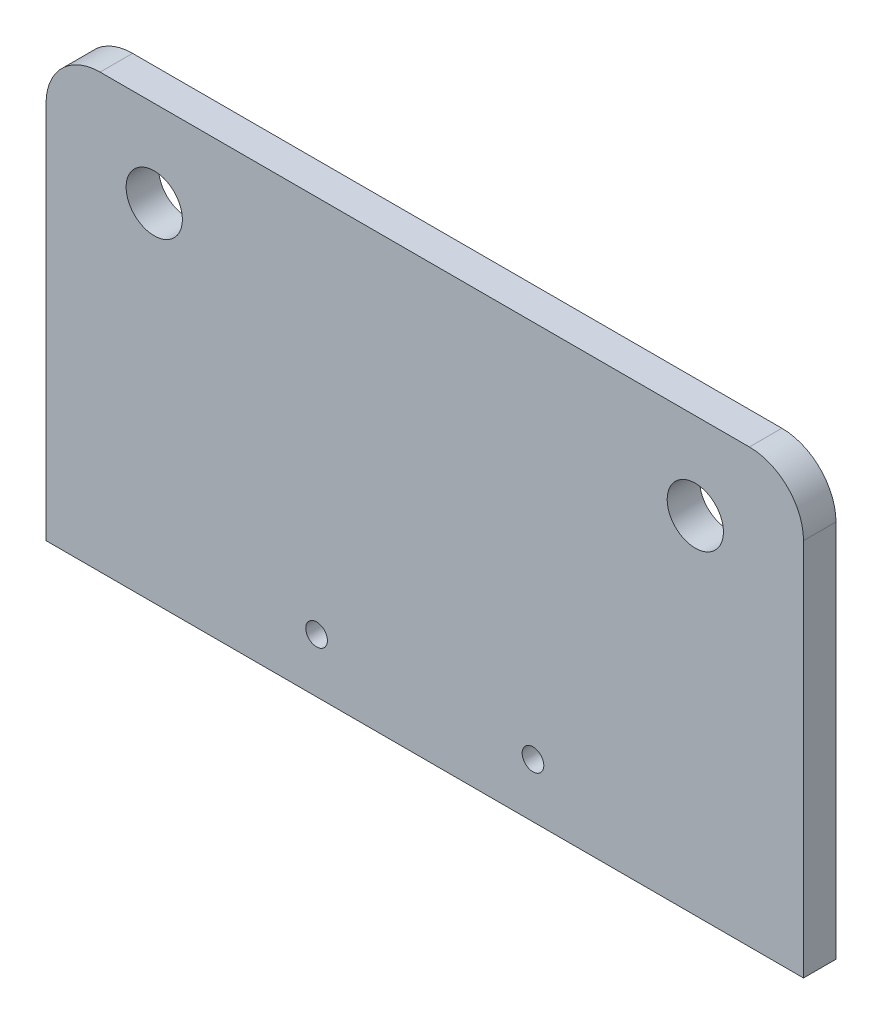
ISO-10303-21;
HEADER;
FILE_DESCRIPTION(('STEP AP214'),'2;1');
FILE_NAME('part.step','',(''),(''),'','','');
FILE_SCHEMA(('AUTOMOTIVE_DESIGN { 1 0 10303 214 1 1 1 1 }'));
ENDSEC;
DATA;
#1=APPLICATION_CONTEXT('core data for automotive mechanical design processes');
#2=APPLICATION_PROTOCOL_DEFINITION('international standard','automotive_design',2000,#1);
#3=PRODUCT_CONTEXT('',#1,'mechanical');
#4=PRODUCT('Part','Part','',(#3));
#5=PRODUCT_RELATED_PRODUCT_CATEGORY('part','',(#4));
#6=PRODUCT_DEFINITION_FORMATION('','',#4);
#7=PRODUCT_DEFINITION_CONTEXT('part definition',#1,'design');
#8=PRODUCT_DEFINITION('design','',#6,#7);
#9=PRODUCT_DEFINITION_SHAPE('','',#8);
#10=(LENGTH_UNIT() NAMED_UNIT(*) SI_UNIT(.MILLI.,.METRE.));
#11=(NAMED_UNIT(*) PLANE_ANGLE_UNIT() SI_UNIT($,.RADIAN.));
#12=(NAMED_UNIT(*) SI_UNIT($,.STERADIAN.) SOLID_ANGLE_UNIT());
#13=UNCERTAINTY_MEASURE_WITH_UNIT(LENGTH_MEASURE(1.E-05),#10,'distance_accuracy_value','');
#14=(GEOMETRIC_REPRESENTATION_CONTEXT(3) GLOBAL_UNCERTAINTY_ASSIGNED_CONTEXT((#13)) GLOBAL_UNIT_ASSIGNED_CONTEXT((#10,
#11,#12)) REPRESENTATION_CONTEXT('',''));
#15=CARTESIAN_POINT('',(0.,0.,0.));
#16=DIRECTION('',(0.,0.,1.));
#17=DIRECTION('',(1.,0.,0.));
#18=AXIS2_PLACEMENT_3D('',#15,#16,#17);
#19=CARTESIAN_POINT('',(-30.,15.,3.));
#20=DIRECTION('',(0.,0.,-1.));
#21=DIRECTION('',(-1.,0.,0.));
#22=AXIS2_PLACEMENT_3D('',#19,#20,#21);
#23=PLANE('',#22);
#24=CARTESIAN_POINT('',(10.,-15.,3.));
#25=DIRECTION('',(0.,0.,-1.));
#26=DIRECTION('',(-1.,0.,0.));
#27=AXIS2_PLACEMENT_3D('',#24,#25,#26);
#28=CIRCLE('',#27,1.);
#29=CARTESIAN_POINT('',(9.,-15.,3.));
#30=VERTEX_POINT('',#29);
#31=EDGE_CURVE('E147',#30,#30,#28,.T.);
#32=ORIENTED_EDGE('',*,*,#31,.T.);
#33=EDGE_LOOP('',(#32));
#34=FACE_BOUND('',#33,.T.);
#35=CARTESIAN_POINT('',(-10.,-15.,3.));
#36=DIRECTION('',(0.,0.,-1.));
#37=DIRECTION('',(1.,0.,0.));
#38=AXIS2_PLACEMENT_3D('',#35,#36,#37);
#39=CIRCLE('',#38,1.);
#40=CARTESIAN_POINT('',(-9.,-15.,3.));
#41=VERTEX_POINT('',#40);
#42=EDGE_CURVE('E153',#41,#41,#39,.T.);
#43=ORIENTED_EDGE('',*,*,#42,.T.);
#44=EDGE_LOOP('',(#43));
#45=FACE_BOUND('',#44,.T.);
#46=DIRECTION('',(0.,-1.,0.));
#47=VECTOR('',#46,1.);
#48=CARTESIAN_POINT('',(-35.,-20.,3.));
#49=LINE('',#48,#47);
#50=CARTESIAN_POINT('',(-35.,15.,3.));
#51=VERTEX_POINT('',#50);
#52=CARTESIAN_POINT('',(-35.,-20.,3.));
#53=VERTEX_POINT('',#52);
#54=EDGE_CURVE('E140',#51,#53,#49,.T.);
#55=ORIENTED_EDGE('',*,*,#54,.T.);
#56=DIRECTION('',(1.,0.,0.));
#57=VECTOR('',#56,1.);
#58=CARTESIAN_POINT('',(-35.,-20.,3.));
#59=LINE('',#58,#57);
#60=CARTESIAN_POINT('',(35.,-20.,3.));
#61=VERTEX_POINT('',#60);
#62=EDGE_CURVE('E98',#53,#61,#59,.T.);
#63=ORIENTED_EDGE('',*,*,#62,.T.);
#64=DIRECTION('',(0.,1.,0.));
#65=VECTOR('',#64,1.);
#66=CARTESIAN_POINT('',(35.,-20.,3.));
#67=LINE('',#66,#65);
#68=CARTESIAN_POINT('',(35.,15.,3.));
#69=VERTEX_POINT('',#68);
#70=EDGE_CURVE('E111',#61,#69,#67,.T.);
#71=ORIENTED_EDGE('',*,*,#70,.T.);
#72=CARTESIAN_POINT('',(30.,15.,3.));
#73=DIRECTION('',(0.,0.,1.));
#74=DIRECTION('',(1.,0.,0.));
#75=AXIS2_PLACEMENT_3D('',#72,#73,#74);
#76=CIRCLE('',#75,5.);
#77=CARTESIAN_POINT('',(30.,20.,3.));
#78=VERTEX_POINT('',#77);
#79=EDGE_CURVE('E105',#69,#78,#76,.T.);
#80=ORIENTED_EDGE('',*,*,#79,.T.);
#81=DIRECTION('',(-1.,0.,0.));
#82=VECTOR('',#81,1.);
#83=CARTESIAN_POINT('',(-30.,20.,3.));
#84=LINE('',#83,#82);
#85=CARTESIAN_POINT('',(-30.,20.,3.));
#86=VERTEX_POINT('',#85);
#87=EDGE_CURVE('E109',#78,#86,#84,.T.);
#88=ORIENTED_EDGE('',*,*,#87,.T.);
#89=CARTESIAN_POINT('',(-30.,15.,3.));
#90=DIRECTION('',(0.,0.,1.));
#91=DIRECTION('',(-1.,0.,0.));
#92=AXIS2_PLACEMENT_3D('',#89,#90,#91);
#93=CIRCLE('',#92,5.);
#94=EDGE_CURVE('E61',#86,#51,#93,.T.);
#95=ORIENTED_EDGE('',*,*,#94,.T.);
#96=EDGE_LOOP('',(#55,#63,#71,#80,#88,#95));
#97=FACE_BOUND('',#96,.T.);
#98=CARTESIAN_POINT('',(-25.,12.,3.));
#99=DIRECTION('',(0.,0.,1.));
#100=DIRECTION('',(1.,0.,0.));
#101=AXIS2_PLACEMENT_3D('',#98,#99,#100);
#102=CIRCLE('',#101,2.6);
#103=CARTESIAN_POINT('',(-22.4,12.,3.));
#104=VERTEX_POINT('',#103);
#105=EDGE_CURVE('E133',#104,#104,#102,.T.);
#106=ORIENTED_EDGE('',*,*,#105,.F.);
#107=EDGE_LOOP('',(#106));
#108=FACE_BOUND('',#107,.T.);
#109=CARTESIAN_POINT('',(25.,12.,3.));
#110=DIRECTION('',(0.,0.,1.));
#111=DIRECTION('',(-1.,0.,0.));
#112=AXIS2_PLACEMENT_3D('',#109,#110,#111);
#113=CIRCLE('',#112,2.59999999999999);
#114=CARTESIAN_POINT('',(22.4,12.,3.));
#115=VERTEX_POINT('',#114);
#116=EDGE_CURVE('E160',#115,#115,#113,.T.);
#117=ORIENTED_EDGE('',*,*,#116,.F.);
#118=EDGE_LOOP('',(#117));
#119=FACE_BOUND('',#118,.T.);
#120=ADVANCED_FACE('F42',(#34,#45,#97,#108,#119),#23,.F.);
#121=CARTESIAN_POINT('',(-30.,15.,0.));
#122=DIRECTION('',(0.,0.,-1.));
#123=DIRECTION('',(-1.,0.,0.));
#124=AXIS2_PLACEMENT_3D('',#121,#122,#123);
#125=PLANE('',#124);
#126=CARTESIAN_POINT('',(10.,-15.,0.));
#127=DIRECTION('',(0.,0.,-1.));
#128=DIRECTION('',(-1.,0.,0.));
#129=AXIS2_PLACEMENT_3D('',#126,#127,#128);
#130=CIRCLE('',#129,1.);
#131=CARTESIAN_POINT('',(9.,-15.,0.));
#132=VERTEX_POINT('',#131);
#133=EDGE_CURVE('E46',#132,#132,#130,.T.);
#134=ORIENTED_EDGE('',*,*,#133,.F.);
#135=EDGE_LOOP('',(#134));
#136=FACE_BOUND('',#135,.T.);
#137=CARTESIAN_POINT('',(-10.,-15.,0.));
#138=DIRECTION('',(0.,0.,-1.));
#139=DIRECTION('',(-1.,0.,0.));
#140=AXIS2_PLACEMENT_3D('',#137,#138,#139);
#141=CIRCLE('',#140,1.);
#142=CARTESIAN_POINT('',(-11.,-15.,0.));
#143=VERTEX_POINT('',#142);
#144=EDGE_CURVE('E145',#143,#143,#141,.T.);
#145=ORIENTED_EDGE('',*,*,#144,.F.);
#146=EDGE_LOOP('',(#145));
#147=FACE_BOUND('',#146,.T.);
#148=CARTESIAN_POINT('',(-25.,12.,0.));
#149=DIRECTION('',(0.,0.,1.));
#150=DIRECTION('',(1.,0.,0.));
#151=AXIS2_PLACEMENT_3D('',#148,#149,#150);
#152=CIRCLE('',#151,2.6);
#153=CARTESIAN_POINT('',(-22.4,12.,0.));
#154=VERTEX_POINT('',#153);
#155=EDGE_CURVE('E163',#154,#154,#152,.T.);
#156=ORIENTED_EDGE('',*,*,#155,.T.);
#157=EDGE_LOOP('',(#156));
#158=FACE_BOUND('',#157,.T.);
#159=DIRECTION('',(0.,-1.,0.));
#160=VECTOR('',#159,1.);
#161=CARTESIAN_POINT('',(-35.,-20.,0.));
#162=LINE('',#161,#160);
#163=CARTESIAN_POINT('',(-35.,15.,0.));
#164=VERTEX_POINT('',#163);
#165=CARTESIAN_POINT('',(-35.,-20.,0.));
#166=VERTEX_POINT('',#165);
#167=EDGE_CURVE('E129',#164,#166,#162,.T.);
#168=ORIENTED_EDGE('',*,*,#167,.F.);
#169=CARTESIAN_POINT('',(-30.,15.,0.));
#170=DIRECTION('',(0.,0.,1.));
#171=DIRECTION('',(-1.,0.,0.));
#172=AXIS2_PLACEMENT_3D('',#169,#170,#171);
#173=CIRCLE('',#172,5.);
#174=CARTESIAN_POINT('',(-30.,20.,0.));
#175=VERTEX_POINT('',#174);
#176=EDGE_CURVE('E90',#175,#164,#173,.T.);
#177=ORIENTED_EDGE('',*,*,#176,.F.);
#178=DIRECTION('',(-1.,0.,0.));
#179=VECTOR('',#178,1.);
#180=CARTESIAN_POINT('',(-30.,20.,0.));
#181=LINE('',#180,#179);
#182=CARTESIAN_POINT('',(30.,20.,0.));
#183=VERTEX_POINT('',#182);
#184=EDGE_CURVE('E84',#183,#175,#181,.T.);
#185=ORIENTED_EDGE('',*,*,#184,.F.);
#186=CARTESIAN_POINT('',(30.,15.,0.));
#187=DIRECTION('',(0.,0.,1.));
#188=DIRECTION('',(1.,0.,0.));
#189=AXIS2_PLACEMENT_3D('',#186,#187,#188);
#190=CIRCLE('',#189,5.);
#191=CARTESIAN_POINT('',(35.,15.,0.));
#192=VERTEX_POINT('',#191);
#193=EDGE_CURVE('E119',#192,#183,#190,.T.);
#194=ORIENTED_EDGE('',*,*,#193,.F.);
#195=DIRECTION('',(0.,1.,0.));
#196=VECTOR('',#195,1.);
#197=CARTESIAN_POINT('',(35.,-20.,0.));
#198=LINE('',#197,#196);
#199=CARTESIAN_POINT('',(35.,-20.,0.));
#200=VERTEX_POINT('',#199);
#201=EDGE_CURVE('E135',#200,#192,#198,.T.);
#202=ORIENTED_EDGE('',*,*,#201,.F.);
#203=DIRECTION('',(1.,0.,0.));
#204=VECTOR('',#203,1.);
#205=CARTESIAN_POINT('',(-35.,-20.,0.));
#206=LINE('',#205,#204);
#207=EDGE_CURVE('E132',#166,#200,#206,.T.);
#208=ORIENTED_EDGE('',*,*,#207,.F.);
#209=EDGE_LOOP('',(#168,#177,#185,#194,#202,#208));
#210=FACE_BOUND('',#209,.T.);
#211=CARTESIAN_POINT('',(25.,12.,0.));
#212=DIRECTION('',(0.,0.,1.));
#213=DIRECTION('',(-1.,0.,0.));
#214=AXIS2_PLACEMENT_3D('',#211,#212,#213);
#215=CIRCLE('',#214,2.59999999999999);
#216=CARTESIAN_POINT('',(22.4,12.,0.));
#217=VERTEX_POINT('',#216);
#218=EDGE_CURVE('E151',#217,#217,#215,.T.);
#219=ORIENTED_EDGE('',*,*,#218,.T.);
#220=EDGE_LOOP('',(#219));
#221=FACE_BOUND('',#220,.T.);
#222=ADVANCED_FACE('F179',(#136,#147,#158,#210,#221),#125,.T.);
#223=CARTESIAN_POINT('',(-35.,-20.,3.));
#224=DIRECTION('',(1.,0.,0.));
#225=DIRECTION('',(0.,0.,-1.));
#226=AXIS2_PLACEMENT_3D('',#223,#224,#225);
#227=PLANE('',#226);
#228=ORIENTED_EDGE('',*,*,#167,.T.);
#229=DIRECTION('',(0.,0.,-1.));
#230=VECTOR('',#229,1.);
#231=CARTESIAN_POINT('',(-35.,-20.,3.));
#232=LINE('',#231,#230);
#233=EDGE_CURVE('E11',#53,#166,#232,.T.);
#234=ORIENTED_EDGE('',*,*,#233,.F.);
#235=ORIENTED_EDGE('',*,*,#54,.F.);
#236=DIRECTION('',(0.,0.,-1.));
#237=VECTOR('',#236,1.);
#238=CARTESIAN_POINT('',(-35.,15.,3.));
#239=LINE('',#238,#237);
#240=EDGE_CURVE('E125',#51,#164,#239,.T.);
#241=ORIENTED_EDGE('',*,*,#240,.T.);
#242=EDGE_LOOP('',(#228,#234,#235,#241));
#243=FACE_BOUND('',#242,.T.);
#244=ADVANCED_FACE('F44',(#243),#227,.F.);
#245=CARTESIAN_POINT('',(-35.,-20.,3.));
#246=DIRECTION('',(0.,1.,0.));
#247=DIRECTION('',(-1.,0.,0.));
#248=AXIS2_PLACEMENT_3D('',#245,#246,#247);
#249=PLANE('',#248);
#250=ORIENTED_EDGE('',*,*,#207,.T.);
#251=DIRECTION('',(0.,0.,-1.));
#252=VECTOR('',#251,1.);
#253=CARTESIAN_POINT('',(35.,-20.,3.));
#254=LINE('',#253,#252);
#255=EDGE_CURVE('E52',#61,#200,#254,.T.);
#256=ORIENTED_EDGE('',*,*,#255,.F.);
#257=ORIENTED_EDGE('',*,*,#62,.F.);
#258=ORIENTED_EDGE('',*,*,#233,.T.);
#259=EDGE_LOOP('',(#250,#256,#257,#258));
#260=FACE_BOUND('',#259,.T.);
#261=ADVANCED_FACE('F173',(#260),#249,.F.);
#262=CARTESIAN_POINT('',(35.,-20.,3.));
#263=DIRECTION('',(-1.,0.,0.));
#264=DIRECTION('',(0.,0.,1.));
#265=AXIS2_PLACEMENT_3D('',#262,#263,#264);
#266=PLANE('',#265);
#267=ORIENTED_EDGE('',*,*,#201,.T.);
#268=DIRECTION('',(0.,0.,-1.));
#269=VECTOR('',#268,1.);
#270=CARTESIAN_POINT('',(35.,15.,3.));
#271=LINE('',#270,#269);
#272=EDGE_CURVE('E120',#69,#192,#271,.T.);
#273=ORIENTED_EDGE('',*,*,#272,.F.);
#274=ORIENTED_EDGE('',*,*,#70,.F.);
#275=ORIENTED_EDGE('',*,*,#255,.T.);
#276=EDGE_LOOP('',(#267,#273,#274,#275));
#277=FACE_BOUND('',#276,.T.);
#278=ADVANCED_FACE('F176',(#277),#266,.F.);
#279=CARTESIAN_POINT('',(30.,15.,3.));
#280=DIRECTION('',(0.,0.,-1.));
#281=DIRECTION('',(-1.,0.,0.));
#282=AXIS2_PLACEMENT_3D('',#279,#280,#281);
#283=CYLINDRICAL_SURFACE('',#282,5.);
#284=ORIENTED_EDGE('',*,*,#193,.T.);
#285=DIRECTION('',(0.,0.,-1.));
#286=VECTOR('',#285,1.);
#287=CARTESIAN_POINT('',(30.,20.,3.));
#288=LINE('',#287,#286);
#289=EDGE_CURVE('E116',#78,#183,#288,.T.);
#290=ORIENTED_EDGE('',*,*,#289,.F.);
#291=ORIENTED_EDGE('',*,*,#79,.F.);
#292=ORIENTED_EDGE('',*,*,#272,.T.);
#293=EDGE_LOOP('',(#284,#290,#291,#292));
#294=FACE_BOUND('',#293,.T.);
#295=ADVANCED_FACE('F117',(#294),#283,.T.);
#296=CARTESIAN_POINT('',(-30.,20.,3.));
#297=DIRECTION('',(0.,-1.,0.));
#298=DIRECTION('',(0.,0.,-1.));
#299=AXIS2_PLACEMENT_3D('',#296,#297,#298);
#300=PLANE('',#299);
#301=ORIENTED_EDGE('',*,*,#184,.T.);
#302=DIRECTION('',(0.,0.,-1.));
#303=VECTOR('',#302,1.);
#304=CARTESIAN_POINT('',(-30.,20.,3.));
#305=LINE('',#304,#303);
#306=EDGE_CURVE('E121',#86,#175,#305,.T.);
#307=ORIENTED_EDGE('',*,*,#306,.F.);
#308=ORIENTED_EDGE('',*,*,#87,.F.);
#309=ORIENTED_EDGE('',*,*,#289,.T.);
#310=EDGE_LOOP('',(#301,#307,#308,#309));
#311=FACE_BOUND('',#310,.T.);
#312=ADVANCED_FACE('F123',(#311),#300,.F.);
#313=CARTESIAN_POINT('',(-30.,15.,3.));
#314=DIRECTION('',(0.,0.,-1.));
#315=DIRECTION('',(-1.,0.,0.));
#316=AXIS2_PLACEMENT_3D('',#313,#314,#315);
#317=CYLINDRICAL_SURFACE('',#316,5.);
#318=ORIENTED_EDGE('',*,*,#176,.T.);
#319=ORIENTED_EDGE('',*,*,#240,.F.);
#320=ORIENTED_EDGE('',*,*,#94,.F.);
#321=ORIENTED_EDGE('',*,*,#306,.T.);
#322=EDGE_LOOP('',(#318,#319,#320,#321));
#323=FACE_BOUND('',#322,.T.);
#324=ADVANCED_FACE('F182',(#323),#317,.T.);
#325=CARTESIAN_POINT('',(-25.,12.,3.));
#326=DIRECTION('',(0.,0.,-1.));
#327=DIRECTION('',(-1.,0.,0.));
#328=AXIS2_PLACEMENT_3D('',#325,#326,#327);
#329=CYLINDRICAL_SURFACE('',#328,2.6);
#330=ORIENTED_EDGE('',*,*,#105,.T.);
#331=EDGE_LOOP('',(#330));
#332=FACE_BOUND('',#331,.T.);
#333=ORIENTED_EDGE('',*,*,#155,.F.);
#334=EDGE_LOOP('',(#333));
#335=FACE_BOUND('',#334,.T.);
#336=ADVANCED_FACE('F184',(#332,#335),#329,.F.);
#337=CARTESIAN_POINT('',(25.,12.,3.));
#338=DIRECTION('',(0.,0.,-1.));
#339=DIRECTION('',(-1.,0.,0.));
#340=AXIS2_PLACEMENT_3D('',#337,#338,#339);
#341=CYLINDRICAL_SURFACE('',#340,2.59999999999999);
#342=ORIENTED_EDGE('',*,*,#116,.T.);
#343=EDGE_LOOP('',(#342));
#344=FACE_BOUND('',#343,.T.);
#345=ORIENTED_EDGE('',*,*,#218,.F.);
#346=EDGE_LOOP('',(#345));
#347=FACE_BOUND('',#346,.T.);
#348=ADVANCED_FACE('F190',(#344,#347),#341,.F.);
#349=CARTESIAN_POINT('',(-10.,-15.,3.));
#350=DIRECTION('',(0.,0.,-1.));
#351=DIRECTION('',(-1.,0.,0.));
#352=AXIS2_PLACEMENT_3D('',#349,#350,#351);
#353=CYLINDRICAL_SURFACE('',#352,1.);
#354=ORIENTED_EDGE('',*,*,#144,.T.);
#355=EDGE_LOOP('',(#354));
#356=FACE_BOUND('',#355,.T.);
#357=ORIENTED_EDGE('',*,*,#42,.F.);
#358=EDGE_LOOP('',(#357));
#359=FACE_BOUND('',#358,.T.);
#360=ADVANCED_FACE('F205',(#356,#359),#353,.F.);
#361=CARTESIAN_POINT('',(10.,-15.,3.));
#362=DIRECTION('',(0.,0.,-1.));
#363=DIRECTION('',(-1.,0.,0.));
#364=AXIS2_PLACEMENT_3D('',#361,#362,#363);
#365=CYLINDRICAL_SURFACE('',#364,1.);
#366=ORIENTED_EDGE('',*,*,#133,.T.);
#367=EDGE_LOOP('',(#366));
#368=FACE_BOUND('',#367,.T.);
#369=ORIENTED_EDGE('',*,*,#31,.F.);
#370=EDGE_LOOP('',(#369));
#371=FACE_BOUND('',#370,.T.);
#372=ADVANCED_FACE('F209',(#368,#371),#365,.F.);
#373=CLOSED_SHELL('',(#120,#222,#244,#261,#278,#295,#312,#324,#336,#348,#360,#372));
#374=MANIFOLD_SOLID_BREP('B2',#373);
#375=ADVANCED_BREP_SHAPE_REPRESENTATION('',(#18,#374),#14);
#376=SHAPE_DEFINITION_REPRESENTATION(#9,#375);
ENDSEC;
END-ISO-10303-21;
